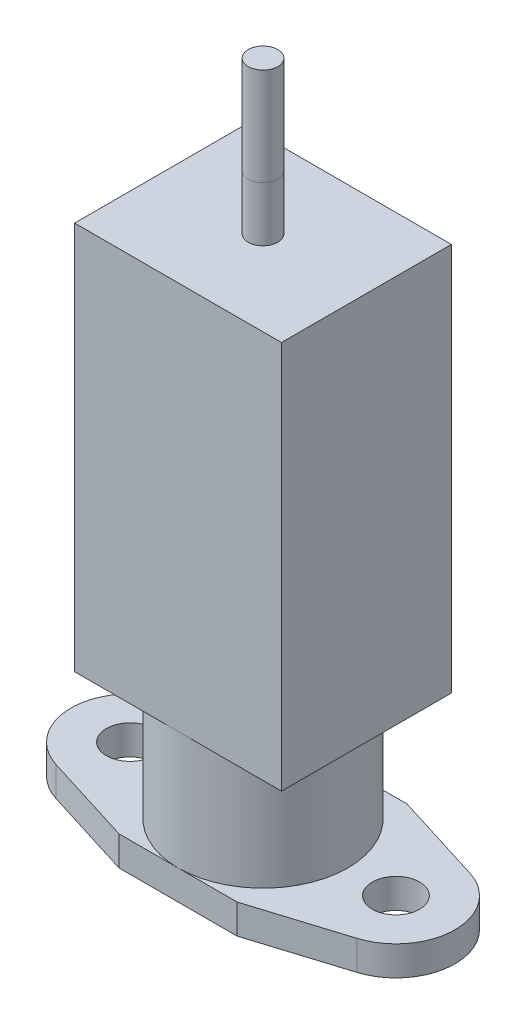
ISO-10303-21;
HEADER;
FILE_DESCRIPTION(('STEP AP214'),'2;1');
FILE_NAME('part.step','',(''),(''),'','','');
FILE_SCHEMA(('AUTOMOTIVE_DESIGN { 1 0 10303 214 1 1 1 1 }'));
ENDSEC;
DATA;
#1=APPLICATION_CONTEXT('core data for automotive mechanical design processes');
#2=APPLICATION_PROTOCOL_DEFINITION('international standard','automotive_design',2000,#1);
#3=PRODUCT_CONTEXT('',#1,'mechanical');
#4=PRODUCT('Part','Part','',(#3));
#5=PRODUCT_RELATED_PRODUCT_CATEGORY('part','',(#4));
#6=PRODUCT_DEFINITION_FORMATION('','',#4);
#7=PRODUCT_DEFINITION_CONTEXT('part definition',#1,'design');
#8=PRODUCT_DEFINITION('design','',#6,#7);
#9=PRODUCT_DEFINITION_SHAPE('','',#8);
#10=(LENGTH_UNIT() NAMED_UNIT(*) SI_UNIT(.MILLI.,.METRE.));
#11=(NAMED_UNIT(*) PLANE_ANGLE_UNIT() SI_UNIT($,.RADIAN.));
#12=(NAMED_UNIT(*) SI_UNIT($,.STERADIAN.) SOLID_ANGLE_UNIT());
#13=UNCERTAINTY_MEASURE_WITH_UNIT(LENGTH_MEASURE(1.E-05),#10,'distance_accuracy_value','');
#14=(GEOMETRIC_REPRESENTATION_CONTEXT(3) GLOBAL_UNCERTAINTY_ASSIGNED_CONTEXT((#13)) GLOBAL_UNIT_ASSIGNED_CONTEXT((#10,
#11,#12)) REPRESENTATION_CONTEXT('',''));
#15=CARTESIAN_POINT('',(0.,0.,0.));
#16=DIRECTION('',(0.,0.,1.));
#17=DIRECTION('',(1.,0.,0.));
#18=AXIS2_PLACEMENT_3D('',#15,#16,#17);
#19=CARTESIAN_POINT('',(0.,46.6,0.));
#20=DIRECTION('',(0.,-1.,0.));
#21=DIRECTION('',(0.,0.,-1.));
#22=AXIS2_PLACEMENT_3D('',#19,#20,#21);
#23=CYLINDRICAL_SURFACE('',#22,1.);
#24=CARTESIAN_POINT('',(0.,46.6,0.));
#25=DIRECTION('',(0.,1.,0.));
#26=DIRECTION('',(0.,0.,1.));
#27=AXIS2_PLACEMENT_3D('',#24,#25,#26);
#28=CIRCLE('',#27,1.);
#29=CARTESIAN_POINT('',(0.,46.6,1.));
#30=VERTEX_POINT('',#29);
#31=EDGE_CURVE('E11',#30,#30,#28,.T.);
#32=ORIENTED_EDGE('',*,*,#31,.F.);
#33=EDGE_LOOP('',(#32));
#34=FACE_BOUND('',#33,.T.);
#35=CARTESIAN_POINT('',(0.,40.,0.));
#36=DIRECTION('',(0.,1.,0.));
#37=DIRECTION('',(0.,0.,1.));
#38=AXIS2_PLACEMENT_3D('',#35,#36,#37);
#39=CIRCLE('',#38,1.);
#40=CARTESIAN_POINT('',(0.,40.,1.));
#41=VERTEX_POINT('',#40);
#42=EDGE_CURVE('E52',#41,#41,#39,.T.);
#43=ORIENTED_EDGE('',*,*,#42,.T.);
#44=EDGE_LOOP('',(#43));
#45=FACE_BOUND('',#44,.T.);
#46=ADVANCED_FACE('F49',(#34,#45),#23,.T.);
#47=CARTESIAN_POINT('',(0.,46.6,0.));
#48=DIRECTION('',(0.,1.,0.));
#49=DIRECTION('',(0.,0.,1.));
#50=AXIS2_PLACEMENT_3D('',#47,#48,#49);
#51=PLANE('',#50);
#52=ORIENTED_EDGE('',*,*,#31,.T.);
#53=EDGE_LOOP('',(#52));
#54=FACE_BOUND('',#53,.T.);
#55=ADVANCED_FACE('F64',(#54),#51,.T.);
#56=CARTESIAN_POINT('',(0.,40.,0.));
#57=DIRECTION('',(0.,1.,0.));
#58=DIRECTION('',(0.,0.,1.));
#59=AXIS2_PLACEMENT_3D('',#56,#57,#58);
#60=PLANE('',#59);
#61=ORIENTED_EDGE('',*,*,#42,.F.);
#62=EDGE_LOOP('',(#61));
#63=FACE_BOUND('',#62,.T.);
#64=ADVANCED_FACE('F62',(#63),#60,.F.);
#65=CLOSED_SHELL('',(#46,#55,#64));
#66=MANIFOLD_SOLID_BREP('B2',#65);
#67=CARTESIAN_POINT('',(0.,2.,0.));
#68=DIRECTION('',(0.,1.,0.));
#69=DIRECTION('',(0.,0.,1.));
#70=AXIS2_PLACEMENT_3D('',#67,#68,#69);
#71=PLANE('',#70);
#72=CARTESIAN_POINT('',(0.,2.,0.));
#73=DIRECTION('',(0.,1.,0.));
#74=DIRECTION('',(0.,0.,1.));
#75=AXIS2_PLACEMENT_3D('',#72,#73,#74);
#76=CIRCLE('',#75,5.75);
#77=CARTESIAN_POINT('',(0.,2.,5.75));
#78=VERTEX_POINT('',#77);
#79=CARTESIAN_POINT('',(0.,2.,-5.75));
#80=VERTEX_POINT('',#79);
#81=EDGE_CURVE('E101',#78,#80,#76,.T.);
#82=ORIENTED_EDGE('',*,*,#81,.F.);
#83=DIRECTION('',(1.,0.,0.));
#84=VECTOR('',#83,1.);
#85=CARTESIAN_POINT('',(0.,2.,5.75));
#86=LINE('',#85,#84);
#87=CARTESIAN_POINT('',(4.,2.,5.75));
#88=VERTEX_POINT('',#87);
#89=EDGE_CURVE('E261',#78,#88,#86,.T.);
#90=ORIENTED_EDGE('',*,*,#89,.T.);
#91=DIRECTION('',(0.95462311177924,0.,-0.297816578546127));
#92=VECTOR('',#91,1.);
#93=CARTESIAN_POINT('',(1.9895187442968,2.,6.3772157476773));
#94=LINE('',#93,#92);
#95=CARTESIAN_POINT('',(10.1912663141845,2.,3.81849244711696));
#96=VERTEX_POINT('',#95);
#97=EDGE_CURVE('E234',#88,#96,#94,.T.);
#98=ORIENTED_EDGE('',*,*,#97,.T.);
#99=CARTESIAN_POINT('',(9.,2.,0.));
#100=DIRECTION('',(0.,1.,0.));
#101=DIRECTION('',(0.,0.,1.));
#102=AXIS2_PLACEMENT_3D('',#99,#100,#101);
#103=CIRCLE('',#102,4.);
#104=CARTESIAN_POINT('',(10.1912663141845,2.,-3.81849244711696));
#105=VERTEX_POINT('',#104);
#106=EDGE_CURVE('E238',#96,#105,#103,.T.);
#107=ORIENTED_EDGE('',*,*,#106,.T.);
#108=DIRECTION('',(0.95462311177924,0.,0.297816578546125));
#109=VECTOR('',#108,1.);
#110=CARTESIAN_POINT('',(1.98951874429678,2.,-6.3772157476773));
#111=LINE('',#110,#109);
#112=CARTESIAN_POINT('',(4.,2.,-5.75));
#113=VERTEX_POINT('',#112);
#114=EDGE_CURVE('E242',#113,#105,#111,.T.);
#115=ORIENTED_EDGE('',*,*,#114,.F.);
#116=DIRECTION('',(1.,0.,0.));
#117=VECTOR('',#116,1.);
#118=CARTESIAN_POINT('',(0.,2.,-5.75));
#119=LINE('',#118,#117);
#120=EDGE_CURVE('E246',#80,#113,#119,.T.);
#121=ORIENTED_EDGE('',*,*,#120,.F.);
#122=EDGE_LOOP('',(#82,#90,#98,#107,#115,#121));
#123=FACE_BOUND('',#122,.T.);
#124=CARTESIAN_POINT('',(9.,2.,0.));
#125=DIRECTION('',(0.,1.,0.));
#126=DIRECTION('',(0.,0.,1.));
#127=AXIS2_PLACEMENT_3D('',#124,#125,#126);
#128=CIRCLE('',#127,1.6);
#129=CARTESIAN_POINT('',(9.,2.,1.6));
#130=VERTEX_POINT('',#129);
#131=EDGE_CURVE('E269',#130,#130,#128,.T.);
#132=ORIENTED_EDGE('',*,*,#131,.F.);
#133=EDGE_LOOP('',(#132));
#134=FACE_BOUND('',#133,.T.);
#135=ADVANCED_FACE('F90',(#123,#134),#71,.T.);
#136=CARTESIAN_POINT('',(1.9895187442968,2.,6.3772157476773));
#137=DIRECTION('',(-0.297816578546127,0.,-0.95462311177924));
#138=DIRECTION('',(-0.95462311177924,0.,0.297816578546127));
#139=AXIS2_PLACEMENT_3D('',#136,#137,#138);
#140=PLANE('',#139);
#141=DIRECTION('',(0.95462311177924,0.,-0.297816578546127));
#142=VECTOR('',#141,1.);
#143=CARTESIAN_POINT('',(1.9895187442968,0.,6.3772157476773));
#144=LINE('',#143,#142);
#145=CARTESIAN_POINT('',(4.,0.,5.75));
#146=VERTEX_POINT('',#145);
#147=CARTESIAN_POINT('',(10.1912663141845,0.,3.81849244711696));
#148=VERTEX_POINT('',#147);
#149=EDGE_CURVE('E232',#146,#148,#144,.T.);
#150=ORIENTED_EDGE('',*,*,#149,.T.);
#151=DIRECTION('',(0.,-1.,0.));
#152=VECTOR('',#151,1.);
#153=CARTESIAN_POINT('',(10.1912663141845,2.,3.81849244711696));
#154=LINE('',#153,#152);
#155=EDGE_CURVE('E94',#96,#148,#154,.T.);
#156=ORIENTED_EDGE('',*,*,#155,.F.);
#157=ORIENTED_EDGE('',*,*,#97,.F.);
#158=DIRECTION('',(0.,-1.,0.));
#159=VECTOR('',#158,1.);
#160=CARTESIAN_POINT('',(4.,2.,5.75));
#161=LINE('',#160,#159);
#162=EDGE_CURVE('E273',#88,#146,#161,.T.);
#163=ORIENTED_EDGE('',*,*,#162,.T.);
#164=EDGE_LOOP('',(#150,#156,#157,#163));
#165=FACE_BOUND('',#164,.T.);
#166=ADVANCED_FACE('F92',(#165),#140,.F.);
#167=CARTESIAN_POINT('',(9.,2.,0.));
#168=DIRECTION('',(0.,-1.,0.));
#169=DIRECTION('',(0.,0.,-1.));
#170=AXIS2_PLACEMENT_3D('',#167,#168,#169);
#171=CYLINDRICAL_SURFACE('',#170,4.);
#172=CARTESIAN_POINT('',(9.,0.,0.));
#173=DIRECTION('',(0.,1.,0.));
#174=DIRECTION('',(0.,0.,1.));
#175=AXIS2_PLACEMENT_3D('',#172,#173,#174);
#176=CIRCLE('',#175,4.);
#177=CARTESIAN_POINT('',(10.1912663141845,0.,-3.81849244711696));
#178=VERTEX_POINT('',#177);
#179=EDGE_CURVE('E277',#148,#178,#176,.T.);
#180=ORIENTED_EDGE('',*,*,#179,.T.);
#181=DIRECTION('',(0.,-1.,0.));
#182=VECTOR('',#181,1.);
#183=CARTESIAN_POINT('',(10.1912663141845,2.,-3.81849244711696));
#184=LINE('',#183,#182);
#185=EDGE_CURVE('E328',#105,#178,#184,.T.);
#186=ORIENTED_EDGE('',*,*,#185,.F.);
#187=ORIENTED_EDGE('',*,*,#106,.F.);
#188=ORIENTED_EDGE('',*,*,#155,.T.);
#189=EDGE_LOOP('',(#180,#186,#187,#188));
#190=FACE_BOUND('',#189,.T.);
#191=ADVANCED_FACE('F337',(#190),#171,.T.);
#192=CARTESIAN_POINT('',(1.98951874429678,2.,-6.3772157476773));
#193=DIRECTION('',(0.297816578546125,0.,-0.95462311177924));
#194=DIRECTION('',(-0.95462311177924,0.,-0.297816578546125));
#195=AXIS2_PLACEMENT_3D('',#192,#193,#194);
#196=PLANE('',#195);
#197=DIRECTION('',(0.95462311177924,0.,0.297816578546125));
#198=VECTOR('',#197,1.);
#199=CARTESIAN_POINT('',(1.98951874429678,0.,-6.3772157476773));
#200=LINE('',#199,#198);
#201=CARTESIAN_POINT('',(4.,0.,-5.75));
#202=VERTEX_POINT('',#201);
#203=EDGE_CURVE('E281',#202,#178,#200,.T.);
#204=ORIENTED_EDGE('',*,*,#203,.F.);
#205=DIRECTION('',(0.,-1.,0.));
#206=VECTOR('',#205,1.);
#207=CARTESIAN_POINT('',(4.,2.,-5.75));
#208=LINE('',#207,#206);
#209=EDGE_CURVE('E326',#113,#202,#208,.T.);
#210=ORIENTED_EDGE('',*,*,#209,.F.);
#211=ORIENTED_EDGE('',*,*,#114,.T.);
#212=ORIENTED_EDGE('',*,*,#185,.T.);
#213=EDGE_LOOP('',(#204,#210,#211,#212));
#214=FACE_BOUND('',#213,.T.);
#215=ADVANCED_FACE('F350',(#214),#196,.T.);
#216=CARTESIAN_POINT('',(0.,2.,-5.75));
#217=DIRECTION('',(0.,0.,-1.));
#218=DIRECTION('',(-1.,0.,0.));
#219=AXIS2_PLACEMENT_3D('',#216,#217,#218);
#220=PLANE('',#219);
#221=DIRECTION('',(1.,0.,0.));
#222=VECTOR('',#221,1.);
#223=CARTESIAN_POINT('',(0.,0.,-5.75));
#224=LINE('',#223,#222);
#225=CARTESIAN_POINT('',(-4.,0.,-5.75));
#226=VERTEX_POINT('',#225);
#227=EDGE_CURVE('E285',#226,#202,#224,.T.);
#228=ORIENTED_EDGE('',*,*,#227,.F.);
#229=DIRECTION('',(0.,-1.,0.));
#230=VECTOR('',#229,1.);
#231=CARTESIAN_POINT('',(-4.,2.,-5.75));
#232=LINE('',#231,#230);
#233=CARTESIAN_POINT('',(-4.,2.,-5.75));
#234=VERTEX_POINT('',#233);
#235=EDGE_CURVE('E323',#234,#226,#232,.T.);
#236=ORIENTED_EDGE('',*,*,#235,.F.);
#237=EDGE_CURVE('E247',#234,#80,#119,.T.);
#238=ORIENTED_EDGE('',*,*,#237,.T.);
#239=ORIENTED_EDGE('',*,*,#120,.T.);
#240=ORIENTED_EDGE('',*,*,#209,.T.);
#241=EDGE_LOOP('',(#228,#236,#238,#239,#240));
#242=FACE_BOUND('',#241,.T.);
#243=ADVANCED_FACE('F373',(#242),#220,.T.);
#244=CARTESIAN_POINT('',(-1.98951874429679,2.,-6.3772157476773));
#245=DIRECTION('',(0.297816578546126,0.,0.95462311177924));
#246=DIRECTION('',(0.95462311177924,0.,-0.297816578546126));
#247=AXIS2_PLACEMENT_3D('',#244,#245,#246);
#248=PLANE('',#247);
#249=DIRECTION('',(-0.95462311177924,0.,0.297816578546126));
#250=VECTOR('',#249,1.);
#251=CARTESIAN_POINT('',(-1.98951874429679,0.,-6.3772157476773));
#252=LINE('',#251,#250);
#253=CARTESIAN_POINT('',(-10.1912663141845,0.,-3.81849244711696));
#254=VERTEX_POINT('',#253);
#255=EDGE_CURVE('E289',#226,#254,#252,.T.);
#256=ORIENTED_EDGE('',*,*,#255,.T.);
#257=DIRECTION('',(0.,-1.,0.));
#258=VECTOR('',#257,1.);
#259=CARTESIAN_POINT('',(-10.1912663141845,2.,-3.81849244711696));
#260=LINE('',#259,#258);
#261=CARTESIAN_POINT('',(-10.1912663141845,2.,-3.81849244711696));
#262=VERTEX_POINT('',#261);
#263=EDGE_CURVE('E319',#262,#254,#260,.T.);
#264=ORIENTED_EDGE('',*,*,#263,.F.);
#265=DIRECTION('',(-0.95462311177924,0.,0.297816578546126));
#266=VECTOR('',#265,1.);
#267=CARTESIAN_POINT('',(-1.98951874429679,2.,-6.3772157476773));
#268=LINE('',#267,#266);
#269=EDGE_CURVE('E251',#234,#262,#268,.T.);
#270=ORIENTED_EDGE('',*,*,#269,.F.);
#271=ORIENTED_EDGE('',*,*,#235,.T.);
#272=EDGE_LOOP('',(#256,#264,#270,#271));
#273=FACE_BOUND('',#272,.T.);
#274=ADVANCED_FACE('F372',(#273),#248,.F.);
#275=CARTESIAN_POINT('',(-9.,2.,0.));
#276=DIRECTION('',(0.,-1.,0.));
#277=DIRECTION('',(0.,0.,-1.));
#278=AXIS2_PLACEMENT_3D('',#275,#276,#277);
#279=CYLINDRICAL_SURFACE('',#278,4.);
#280=CARTESIAN_POINT('',(-9.,0.,0.));
#281=DIRECTION('',(0.,1.,0.));
#282=DIRECTION('',(0.,0.,1.));
#283=AXIS2_PLACEMENT_3D('',#280,#281,#282);
#284=CIRCLE('',#283,4.);
#285=CARTESIAN_POINT('',(-10.1912663141845,0.,3.81849244711696));
#286=VERTEX_POINT('',#285);
#287=EDGE_CURVE('E292',#254,#286,#284,.T.);
#288=ORIENTED_EDGE('',*,*,#287,.T.);
#289=DIRECTION('',(0.,-1.,0.));
#290=VECTOR('',#289,1.);
#291=CARTESIAN_POINT('',(-10.1912663141845,2.,3.81849244711696));
#292=LINE('',#291,#290);
#293=CARTESIAN_POINT('',(-10.1912663141845,2.,3.81849244711696));
#294=VERTEX_POINT('',#293);
#295=EDGE_CURVE('E316',#294,#286,#292,.T.);
#296=ORIENTED_EDGE('',*,*,#295,.F.);
#297=CARTESIAN_POINT('',(-9.,2.,0.));
#298=DIRECTION('',(0.,1.,0.));
#299=DIRECTION('',(0.,0.,1.));
#300=AXIS2_PLACEMENT_3D('',#297,#298,#299);
#301=CIRCLE('',#300,4.);
#302=EDGE_CURVE('E254',#262,#294,#301,.T.);
#303=ORIENTED_EDGE('',*,*,#302,.F.);
#304=ORIENTED_EDGE('',*,*,#263,.T.);
#305=EDGE_LOOP('',(#288,#296,#303,#304));
#306=FACE_BOUND('',#305,.T.);
#307=ADVANCED_FACE('F367',(#306),#279,.T.);
#308=CARTESIAN_POINT('',(-1.98951874429679,2.,6.3772157476773));
#309=DIRECTION('',(-0.297816578546126,0.,0.95462311177924));
#310=DIRECTION('',(0.95462311177924,0.,0.297816578546126));
#311=AXIS2_PLACEMENT_3D('',#308,#309,#310);
#312=PLANE('',#311);
#313=DIRECTION('',(-0.95462311177924,0.,-0.297816578546126));
#314=VECTOR('',#313,1.);
#315=CARTESIAN_POINT('',(-1.98951874429679,0.,6.3772157476773));
#316=LINE('',#315,#314);
#317=CARTESIAN_POINT('',(-4.,0.,5.75));
#318=VERTEX_POINT('',#317);
#319=EDGE_CURVE('E296',#318,#286,#316,.T.);
#320=ORIENTED_EDGE('',*,*,#319,.F.);
#321=DIRECTION('',(0.,-1.,0.));
#322=VECTOR('',#321,1.);
#323=CARTESIAN_POINT('',(-4.,2.,5.75));
#324=LINE('',#323,#322);
#325=CARTESIAN_POINT('',(-4.,2.,5.75));
#326=VERTEX_POINT('',#325);
#327=EDGE_CURVE('E313',#326,#318,#324,.T.);
#328=ORIENTED_EDGE('',*,*,#327,.F.);
#329=DIRECTION('',(-0.95462311177924,0.,-0.297816578546126));
#330=VECTOR('',#329,1.);
#331=CARTESIAN_POINT('',(-1.98951874429679,2.,6.3772157476773));
#332=LINE('',#331,#330);
#333=EDGE_CURVE('E257',#326,#294,#332,.T.);
#334=ORIENTED_EDGE('',*,*,#333,.T.);
#335=ORIENTED_EDGE('',*,*,#295,.T.);
#336=EDGE_LOOP('',(#320,#328,#334,#335));
#337=FACE_BOUND('',#336,.T.);
#338=ADVANCED_FACE('F363',(#337),#312,.T.);
#339=CARTESIAN_POINT('',(-9.,2.,0.));
#340=DIRECTION('',(0.,-1.,0.));
#341=DIRECTION('',(0.,0.,-1.));
#342=AXIS2_PLACEMENT_3D('',#339,#340,#341);
#343=CYLINDRICAL_SURFACE('',#342,1.6);
#344=CARTESIAN_POINT('',(-9.,2.,0.));
#345=DIRECTION('',(0.,1.,0.));
#346=DIRECTION('',(0.,0.,1.));
#347=AXIS2_PLACEMENT_3D('',#344,#345,#346);
#348=CIRCLE('',#347,1.6);
#349=CARTESIAN_POINT('',(-9.,2.,1.6));
#350=VERTEX_POINT('',#349);
#351=EDGE_CURVE('E265',#350,#350,#348,.T.);
#352=ORIENTED_EDGE('',*,*,#351,.T.);
#353=EDGE_LOOP('',(#352));
#354=FACE_BOUND('',#353,.T.);
#355=CARTESIAN_POINT('',(-9.,0.,0.));
#356=DIRECTION('',(0.,1.,0.));
#357=DIRECTION('',(0.,0.,1.));
#358=AXIS2_PLACEMENT_3D('',#355,#356,#357);
#359=CIRCLE('',#358,1.6);
#360=CARTESIAN_POINT('',(-9.,0.,1.6));
#361=VERTEX_POINT('',#360);
#362=EDGE_CURVE('E303',#361,#361,#359,.T.);
#363=ORIENTED_EDGE('',*,*,#362,.F.);
#364=EDGE_LOOP('',(#363));
#365=FACE_BOUND('',#364,.T.);
#366=ADVANCED_FACE('F404',(#354,#365),#343,.F.);
#367=CARTESIAN_POINT('',(0.,2.,5.75));
#368=DIRECTION('',(0.,0.,-1.));
#369=DIRECTION('',(-1.,0.,0.));
#370=AXIS2_PLACEMENT_3D('',#367,#368,#369);
#371=PLANE('',#370);
#372=DIRECTION('',(1.,0.,0.));
#373=VECTOR('',#372,1.);
#374=CARTESIAN_POINT('',(0.,0.,5.75));
#375=LINE('',#374,#373);
#376=EDGE_CURVE('E300',#318,#146,#375,.T.);
#377=ORIENTED_EDGE('',*,*,#376,.T.);
#378=ORIENTED_EDGE('',*,*,#162,.F.);
#379=ORIENTED_EDGE('',*,*,#89,.F.);
#380=EDGE_CURVE('E262',#326,#78,#86,.T.);
#381=ORIENTED_EDGE('',*,*,#380,.F.);
#382=ORIENTED_EDGE('',*,*,#327,.T.);
#383=EDGE_LOOP('',(#377,#378,#379,#381,#382));
#384=FACE_BOUND('',#383,.T.);
#385=ADVANCED_FACE('F360',(#384),#371,.F.);
#386=CARTESIAN_POINT('',(9.,2.,0.));
#387=DIRECTION('',(0.,-1.,0.));
#388=DIRECTION('',(0.,0.,-1.));
#389=AXIS2_PLACEMENT_3D('',#386,#387,#388);
#390=CYLINDRICAL_SURFACE('',#389,1.6);
#391=ORIENTED_EDGE('',*,*,#131,.T.);
#392=EDGE_LOOP('',(#391));
#393=FACE_BOUND('',#392,.T.);
#394=CARTESIAN_POINT('',(9.,0.,0.));
#395=DIRECTION('',(0.,1.,0.));
#396=DIRECTION('',(0.,0.,1.));
#397=AXIS2_PLACEMENT_3D('',#394,#395,#396);
#398=CIRCLE('',#397,1.6);
#399=CARTESIAN_POINT('',(9.,0.,1.6));
#400=VERTEX_POINT('',#399);
#401=EDGE_CURVE('E239',#400,#400,#398,.T.);
#402=ORIENTED_EDGE('',*,*,#401,.F.);
#403=EDGE_LOOP('',(#402));
#404=FACE_BOUND('',#403,.T.);
#405=ADVANCED_FACE('F395',(#393,#404),#390,.F.);
#406=EDGE_CURVE('E47',#80,#78,#76,.T.);
#407=ORIENTED_EDGE('',*,*,#406,.F.);
#408=ORIENTED_EDGE('',*,*,#237,.F.);
#409=ORIENTED_EDGE('',*,*,#269,.T.);
#410=ORIENTED_EDGE('',*,*,#302,.T.);
#411=ORIENTED_EDGE('',*,*,#333,.F.);
#412=ORIENTED_EDGE('',*,*,#380,.T.);
#413=EDGE_LOOP('',(#407,#408,#409,#410,#411,#412));
#414=FACE_BOUND('',#413,.T.);
#415=ORIENTED_EDGE('',*,*,#351,.F.);
#416=EDGE_LOOP('',(#415));
#417=FACE_BOUND('',#416,.T.);
#418=ADVANCED_FACE('F386',(#414,#417),#71,.T.);
#419=CARTESIAN_POINT('',(0.,0.,0.));
#420=DIRECTION('',(0.,1.,0.));
#421=DIRECTION('',(0.,0.,1.));
#422=AXIS2_PLACEMENT_3D('',#419,#420,#421);
#423=PLANE('',#422);
#424=ORIENTED_EDGE('',*,*,#149,.F.);
#425=ORIENTED_EDGE('',*,*,#376,.F.);
#426=ORIENTED_EDGE('',*,*,#319,.T.);
#427=ORIENTED_EDGE('',*,*,#287,.F.);
#428=ORIENTED_EDGE('',*,*,#255,.F.);
#429=ORIENTED_EDGE('',*,*,#227,.T.);
#430=ORIENTED_EDGE('',*,*,#203,.T.);
#431=ORIENTED_EDGE('',*,*,#179,.F.);
#432=EDGE_LOOP('',(#424,#425,#426,#427,#428,#429,#430,#431));
#433=FACE_BOUND('',#432,.T.);
#434=ORIENTED_EDGE('',*,*,#362,.T.);
#435=EDGE_LOOP('',(#434));
#436=FACE_BOUND('',#435,.T.);
#437=ORIENTED_EDGE('',*,*,#401,.T.);
#438=EDGE_LOOP('',(#437));
#439=FACE_BOUND('',#438,.T.);
#440=ADVANCED_FACE('F344',(#433,#436,#439),#423,.F.);
#441=CARTESIAN_POINT('',(0.,10.,0.));
#442=DIRECTION('',(0.,-1.,0.));
#443=DIRECTION('',(0.,0.,-1.));
#444=AXIS2_PLACEMENT_3D('',#441,#442,#443);
#445=CYLINDRICAL_SURFACE('',#444,5.75);
#446=CARTESIAN_POINT('',(0.,10.,0.));
#447=DIRECTION('',(0.,1.,0.));
#448=DIRECTION('',(0.,0.,1.));
#449=AXIS2_PLACEMENT_3D('',#446,#447,#448);
#450=CIRCLE('',#449,5.75);
#451=CARTESIAN_POINT('',(0.,10.,5.75));
#452=VERTEX_POINT('',#451);
#453=CARTESIAN_POINT('',(0.,10.,-5.75));
#454=VERTEX_POINT('',#453);
#455=EDGE_CURVE('E230',#452,#454,#450,.T.);
#456=ORIENTED_EDGE('',*,*,#455,.F.);
#457=EDGE_CURVE('E107',#454,#452,#450,.T.);
#458=ORIENTED_EDGE('',*,*,#457,.F.);
#459=EDGE_LOOP('',(#456,#458));
#460=FACE_BOUND('',#459,.T.);
#461=ORIENTED_EDGE('',*,*,#81,.T.);
#462=ORIENTED_EDGE('',*,*,#406,.T.);
#463=EDGE_LOOP('',(#461,#462));
#464=FACE_BOUND('',#463,.T.);
#465=ADVANCED_FACE('F375',(#460,#464),#445,.T.);
#466=CARTESIAN_POINT('',(0.,10.,0.));
#467=DIRECTION('',(0.,1.,0.));
#468=DIRECTION('',(0.,0.,1.));
#469=AXIS2_PLACEMENT_3D('',#466,#467,#468);
#470=PLANE('',#469);
#471=DIRECTION('',(1.,0.,0.));
#472=VECTOR('',#471,1.);
#473=CARTESIAN_POINT('',(-7.,10.,5.75));
#474=LINE('',#473,#472);
#475=CARTESIAN_POINT('',(7.,10.,5.75));
#476=VERTEX_POINT('',#475);
#477=EDGE_CURVE('E589',#452,#476,#474,.T.);
#478=ORIENTED_EDGE('',*,*,#477,.F.);
#479=ORIENTED_EDGE('',*,*,#455,.T.);
#480=DIRECTION('',(-1.,0.,0.));
#481=VECTOR('',#480,1.);
#482=CARTESIAN_POINT('',(-7.,10.,-5.75));
#483=LINE('',#482,#481);
#484=CARTESIAN_POINT('',(7.,10.,-5.75));
#485=VERTEX_POINT('',#484);
#486=EDGE_CURVE('E583',#485,#454,#483,.T.);
#487=ORIENTED_EDGE('',*,*,#486,.F.);
#488=DIRECTION('',(0.,0.,-1.));
#489=VECTOR('',#488,1.);
#490=CARTESIAN_POINT('',(7.,10.,-5.75));
#491=LINE('',#490,#489);
#492=EDGE_CURVE('E220',#476,#485,#491,.T.);
#493=ORIENTED_EDGE('',*,*,#492,.F.);
#494=EDGE_LOOP('',(#478,#479,#487,#493));
#495=FACE_BOUND('',#494,.T.);
#496=ADVANCED_FACE('F377',(#495),#470,.F.);
#497=CARTESIAN_POINT('',(-7.,10.,-5.75));
#498=VERTEX_POINT('',#497);
#499=EDGE_CURVE('E573',#454,#498,#483,.T.);
#500=ORIENTED_EDGE('',*,*,#499,.F.);
#501=ORIENTED_EDGE('',*,*,#457,.T.);
#502=CARTESIAN_POINT('',(-7.,10.,5.75));
#503=VERTEX_POINT('',#502);
#504=EDGE_CURVE('E216',#503,#452,#474,.T.);
#505=ORIENTED_EDGE('',*,*,#504,.F.);
#506=DIRECTION('',(0.,0.,1.));
#507=VECTOR('',#506,1.);
#508=CARTESIAN_POINT('',(-7.,10.,-5.75));
#509=LINE('',#508,#507);
#510=EDGE_CURVE('E586',#498,#503,#509,.T.);
#511=ORIENTED_EDGE('',*,*,#510,.F.);
#512=EDGE_LOOP('',(#500,#501,#505,#511));
#513=FACE_BOUND('',#512,.T.);
#514=ADVANCED_FACE('F383',(#513),#470,.F.);
#515=CARTESIAN_POINT('',(7.,36.3,-5.75));
#516=DIRECTION('',(-1.,0.,0.));
#517=DIRECTION('',(0.,0.,1.));
#518=AXIS2_PLACEMENT_3D('',#515,#516,#517);
#519=PLANE('',#518);
#520=ORIENTED_EDGE('',*,*,#492,.T.);
#521=DIRECTION('',(0.,-1.,0.));
#522=VECTOR('',#521,1.);
#523=CARTESIAN_POINT('',(7.,36.3,-5.75));
#524=LINE('',#523,#522);
#525=CARTESIAN_POINT('',(7.,36.3,-5.75));
#526=VERTEX_POINT('',#525);
#527=EDGE_CURVE('E198',#526,#485,#524,.T.);
#528=ORIENTED_EDGE('',*,*,#527,.F.);
#529=DIRECTION('',(0.,0.,-1.));
#530=VECTOR('',#529,1.);
#531=CARTESIAN_POINT('',(7.,36.3,-5.75));
#532=LINE('',#531,#530);
#533=CARTESIAN_POINT('',(7.,36.3,5.75));
#534=VERTEX_POINT('',#533);
#535=EDGE_CURVE('E206',#534,#526,#532,.T.);
#536=ORIENTED_EDGE('',*,*,#535,.F.);
#537=DIRECTION('',(0.,-1.,0.));
#538=VECTOR('',#537,1.);
#539=CARTESIAN_POINT('',(7.,36.3,5.75));
#540=LINE('',#539,#538);
#541=EDGE_CURVE('E581',#534,#476,#540,.T.);
#542=ORIENTED_EDGE('',*,*,#541,.T.);
#543=EDGE_LOOP('',(#520,#528,#536,#542));
#544=FACE_BOUND('',#543,.T.);
#545=ADVANCED_FACE('F218',(#544),#519,.F.);
#546=CARTESIAN_POINT('',(-7.,36.3,-5.75));
#547=DIRECTION('',(0.,0.,1.));
#548=DIRECTION('',(1.,0.,0.));
#549=AXIS2_PLACEMENT_3D('',#546,#547,#548);
#550=PLANE('',#549);
#551=ORIENTED_EDGE('',*,*,#486,.T.);
#552=ORIENTED_EDGE('',*,*,#499,.T.);
#553=DIRECTION('',(0.,-1.,0.));
#554=VECTOR('',#553,1.);
#555=CARTESIAN_POINT('',(-7.,36.3,-5.75));
#556=LINE('',#555,#554);
#557=CARTESIAN_POINT('',(-7.,36.3,-5.75));
#558=VERTEX_POINT('',#557);
#559=EDGE_CURVE('E201',#558,#498,#556,.T.);
#560=ORIENTED_EDGE('',*,*,#559,.F.);
#561=DIRECTION('',(-1.,0.,0.));
#562=VECTOR('',#561,1.);
#563=CARTESIAN_POINT('',(-7.,36.3,-5.75));
#564=LINE('',#563,#562);
#565=EDGE_CURVE('E193',#526,#558,#564,.T.);
#566=ORIENTED_EDGE('',*,*,#565,.F.);
#567=ORIENTED_EDGE('',*,*,#527,.T.);
#568=EDGE_LOOP('',(#551,#552,#560,#566,#567));
#569=FACE_BOUND('',#568,.T.);
#570=ADVANCED_FACE('F196',(#569),#550,.F.);
#571=CARTESIAN_POINT('',(-7.,36.3,-5.75));
#572=DIRECTION('',(1.,0.,0.));
#573=DIRECTION('',(0.,0.,-1.));
#574=AXIS2_PLACEMENT_3D('',#571,#572,#573);
#575=PLANE('',#574);
#576=ORIENTED_EDGE('',*,*,#510,.T.);
#577=DIRECTION('',(0.,-1.,0.));
#578=VECTOR('',#577,1.);
#579=CARTESIAN_POINT('',(-7.,36.3,5.75));
#580=LINE('',#579,#578);
#581=CARTESIAN_POINT('',(-7.,36.3,5.75));
#582=VERTEX_POINT('',#581);
#583=EDGE_CURVE('E226',#582,#503,#580,.T.);
#584=ORIENTED_EDGE('',*,*,#583,.F.);
#585=DIRECTION('',(0.,0.,1.));
#586=VECTOR('',#585,1.);
#587=CARTESIAN_POINT('',(-7.,36.3,-5.75));
#588=LINE('',#587,#586);
#589=EDGE_CURVE('E205',#558,#582,#588,.T.);
#590=ORIENTED_EDGE('',*,*,#589,.F.);
#591=ORIENTED_EDGE('',*,*,#559,.T.);
#592=EDGE_LOOP('',(#576,#584,#590,#591));
#593=FACE_BOUND('',#592,.T.);
#594=ADVANCED_FACE('F511',(#593),#575,.F.);
#595=CARTESIAN_POINT('',(-7.,36.3,5.75));
#596=DIRECTION('',(0.,0.,-1.));
#597=DIRECTION('',(-1.,0.,0.));
#598=AXIS2_PLACEMENT_3D('',#595,#596,#597);
#599=PLANE('',#598);
#600=ORIENTED_EDGE('',*,*,#504,.T.);
#601=ORIENTED_EDGE('',*,*,#477,.T.);
#602=ORIENTED_EDGE('',*,*,#541,.F.);
#603=DIRECTION('',(1.,0.,0.));
#604=VECTOR('',#603,1.);
#605=CARTESIAN_POINT('',(-7.,36.3,5.75));
#606=LINE('',#605,#604);
#607=EDGE_CURVE('E211',#582,#534,#606,.T.);
#608=ORIENTED_EDGE('',*,*,#607,.F.);
#609=ORIENTED_EDGE('',*,*,#583,.T.);
#610=EDGE_LOOP('',(#600,#601,#602,#608,#609));
#611=FACE_BOUND('',#610,.T.);
#612=ADVANCED_FACE('F519',(#611),#599,.F.);
#613=CARTESIAN_POINT('',(0.,36.3,0.));
#614=DIRECTION('',(0.,1.,0.));
#615=DIRECTION('',(0.,0.,1.));
#616=AXIS2_PLACEMENT_3D('',#613,#614,#615);
#617=PLANE('',#616);
#618=CARTESIAN_POINT('',(0.,36.3,0.));
#619=DIRECTION('',(0.,1.,0.));
#620=DIRECTION('',(0.,0.,1.));
#621=AXIS2_PLACEMENT_3D('',#618,#619,#620);
#622=CIRCLE('',#621,1.);
#623=CARTESIAN_POINT('',(0.,36.3,1.));
#624=VERTEX_POINT('',#623);
#625=EDGE_CURVE('E569',#624,#624,#622,.T.);
#626=ORIENTED_EDGE('',*,*,#625,.F.);
#627=EDGE_LOOP('',(#626));
#628=FACE_BOUND('',#627,.T.);
#629=ORIENTED_EDGE('',*,*,#535,.T.);
#630=ORIENTED_EDGE('',*,*,#565,.T.);
#631=ORIENTED_EDGE('',*,*,#589,.T.);
#632=ORIENTED_EDGE('',*,*,#607,.T.);
#633=EDGE_LOOP('',(#629,#630,#631,#632));
#634=FACE_BOUND('',#633,.T.);
#635=ADVANCED_FACE('F209',(#628,#634),#617,.T.);
#636=CARTESIAN_POINT('',(0.,40.,0.));
#637=DIRECTION('',(0.,-1.,0.));
#638=DIRECTION('',(0.,0.,-1.));
#639=AXIS2_PLACEMENT_3D('',#636,#637,#638);
#640=CYLINDRICAL_SURFACE('',#639,1.);
#641=CARTESIAN_POINT('',(0.,40.,0.));
#642=DIRECTION('',(0.,1.,0.));
#643=DIRECTION('',(0.,0.,1.));
#644=AXIS2_PLACEMENT_3D('',#641,#642,#643);
#645=CIRCLE('',#644,1.);
#646=CARTESIAN_POINT('',(0.,40.,1.));
#647=VERTEX_POINT('',#646);
#648=EDGE_CURVE('E567',#647,#647,#645,.T.);
#649=ORIENTED_EDGE('',*,*,#648,.F.);
#650=EDGE_LOOP('',(#649));
#651=FACE_BOUND('',#650,.T.);
#652=ORIENTED_EDGE('',*,*,#625,.T.);
#653=EDGE_LOOP('',(#652));
#654=FACE_BOUND('',#653,.T.);
#655=ADVANCED_FACE('F536',(#651,#654),#640,.T.);
#656=CARTESIAN_POINT('',(0.,40.,0.));
#657=DIRECTION('',(0.,1.,0.));
#658=DIRECTION('',(0.,0.,1.));
#659=AXIS2_PLACEMENT_3D('',#656,#657,#658);
#660=PLANE('',#659);
#661=ORIENTED_EDGE('',*,*,#648,.T.);
#662=EDGE_LOOP('',(#661));
#663=FACE_BOUND('',#662,.T.);
#664=ADVANCED_FACE('F545',(#663),#660,.T.);
#665=CLOSED_SHELL('',(#135,#166,#191,#215,#243,#274,#307,#338,#366,#385,#405,#418,#440,#465,
#496,#514,#545,#570,#594,#612,#635,#655,#664));
#666=MANIFOLD_SOLID_BREP('B6',#665);
#667=ADVANCED_BREP_SHAPE_REPRESENTATION('',(#18,#66,#666),#14);
#668=SHAPE_DEFINITION_REPRESENTATION(#9,#667);
ENDSEC;
END-ISO-10303-21;
